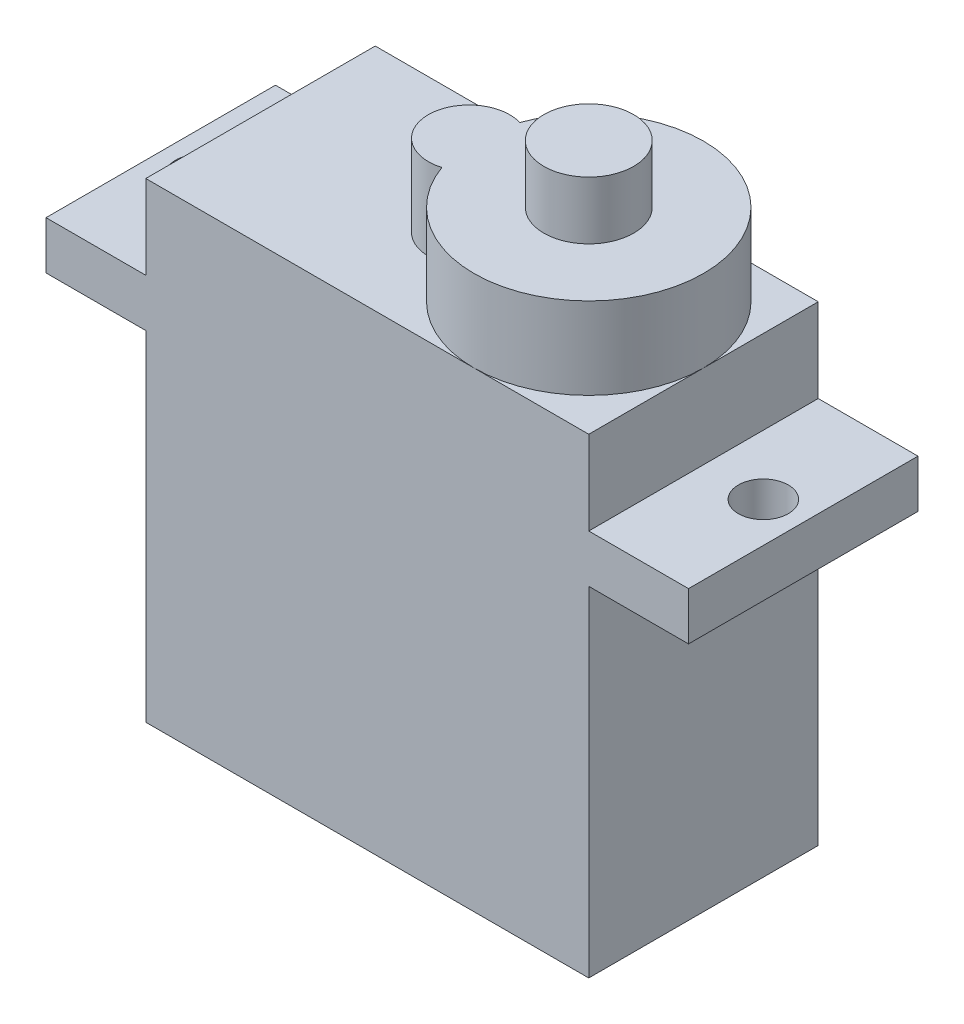
ISO-10303-21;
HEADER;
FILE_DESCRIPTION(('STEP AP214'),'2;1');
FILE_NAME('part.step','',(''),(''),'','','');
FILE_SCHEMA(('AUTOMOTIVE_DESIGN { 1 0 10303 214 1 1 1 1 }'));
ENDSEC;
DATA;
#1=APPLICATION_CONTEXT('core data for automotive mechanical design processes');
#2=APPLICATION_PROTOCOL_DEFINITION('international standard','automotive_design',2000,#1);
#3=PRODUCT_CONTEXT('',#1,'mechanical');
#4=PRODUCT('Part','Part','',(#3));
#5=PRODUCT_RELATED_PRODUCT_CATEGORY('part','',(#4));
#6=PRODUCT_DEFINITION_FORMATION('','',#4);
#7=PRODUCT_DEFINITION_CONTEXT('part definition',#1,'design');
#8=PRODUCT_DEFINITION('design','',#6,#7);
#9=PRODUCT_DEFINITION_SHAPE('','',#8);
#10=(LENGTH_UNIT() NAMED_UNIT(*) SI_UNIT(.MILLI.,.METRE.));
#11=(NAMED_UNIT(*) PLANE_ANGLE_UNIT() SI_UNIT($,.RADIAN.));
#12=(NAMED_UNIT(*) SI_UNIT($,.STERADIAN.) SOLID_ANGLE_UNIT());
#13=UNCERTAINTY_MEASURE_WITH_UNIT(LENGTH_MEASURE(1.E-05),#10,'distance_accuracy_value','');
#14=(GEOMETRIC_REPRESENTATION_CONTEXT(3) GLOBAL_UNCERTAINTY_ASSIGNED_CONTEXT((#13)) GLOBAL_UNIT_ASSIGNED_CONTEXT((#10,
#11,#12)) REPRESENTATION_CONTEXT('',''));
#15=CARTESIAN_POINT('',(0.,0.,0.));
#16=DIRECTION('',(0.,0.,1.));
#17=DIRECTION('',(1.,0.,0.));
#18=AXIS2_PLACEMENT_3D('',#15,#16,#17);
#19=CARTESIAN_POINT('',(5.35,18.8,5.75));
#20=DIRECTION('',(0.,-1.,0.));
#21=DIRECTION('',(0.,0.,-1.));
#22=AXIS2_PLACEMENT_3D('',#19,#20,#21);
#23=CYLINDRICAL_SURFACE('',#22,2.25);
#24=CARTESIAN_POINT('',(5.35,18.8,5.75));
#25=DIRECTION('',(0.,1.,0.));
#26=DIRECTION('',(0.,0.,1.));
#27=AXIS2_PLACEMENT_3D('',#24,#25,#26);
#28=CIRCLE('',#27,2.25);
#29=CARTESIAN_POINT('',(5.35,18.8,8.));
#30=VERTEX_POINT('',#29);
#31=EDGE_CURVE('E11',#30,#30,#28,.T.);
#32=ORIENTED_EDGE('',*,*,#31,.F.);
#33=EDGE_LOOP('',(#32));
#34=FACE_BOUND('',#33,.T.);
#35=CARTESIAN_POINT('',(5.35,11.8,5.75));
#36=DIRECTION('',(0.,1.,0.));
#37=DIRECTION('',(0.,0.,1.));
#38=AXIS2_PLACEMENT_3D('',#35,#36,#37);
#39=CIRCLE('',#38,2.25);
#40=CARTESIAN_POINT('',(5.35,11.8,8.));
#41=VERTEX_POINT('',#40);
#42=EDGE_CURVE('E49',#41,#41,#39,.T.);
#43=ORIENTED_EDGE('',*,*,#42,.T.);
#44=EDGE_LOOP('',(#43));
#45=FACE_BOUND('',#44,.T.);
#46=ADVANCED_FACE('F46',(#34,#45),#23,.T.);
#47=CARTESIAN_POINT('',(0.,18.8,0.));
#48=DIRECTION('',(0.,1.,0.));
#49=DIRECTION('',(0.,0.,1.));
#50=AXIS2_PLACEMENT_3D('',#47,#48,#49);
#51=PLANE('',#50);
#52=ORIENTED_EDGE('',*,*,#31,.T.);
#53=EDGE_LOOP('',(#52));
#54=FACE_BOUND('',#53,.T.);
#55=ADVANCED_FACE('F61',(#54),#51,.T.);
#56=CARTESIAN_POINT('',(0.,11.8,0.));
#57=DIRECTION('',(0.,1.,0.));
#58=DIRECTION('',(0.,0.,1.));
#59=AXIS2_PLACEMENT_3D('',#56,#57,#58);
#60=PLANE('',#59);
#61=ORIENTED_EDGE('',*,*,#42,.F.);
#62=EDGE_LOOP('',(#61));
#63=FACE_BOUND('',#62,.T.);
#64=ADVANCED_FACE('F59',(#63),#60,.F.);
#65=CLOSED_SHELL('',(#46,#55,#64));
#66=MANIFOLD_SOLID_BREP('B2',#65);
#67=CARTESIAN_POINT('',(-11.1,11.8,11.5));
#68=DIRECTION('',(0.,-1.,0.));
#69=DIRECTION('',(0.,0.,-1.));
#70=AXIS2_PLACEMENT_3D('',#67,#68,#69);
#71=PLANE('',#70);
#72=CARTESIAN_POINT('',(5.35,11.8,5.75));
#73=DIRECTION('',(0.,1.,0.));
#74=DIRECTION('',(0.,0.,1.));
#75=AXIS2_PLACEMENT_3D('',#72,#73,#74);
#76=CIRCLE('',#75,5.75);
#77=CARTESIAN_POINT('',(-0.0586735501245782,11.8,7.70160201582772));
#78=VERTEX_POINT('',#77);
#79=CARTESIAN_POINT('',(5.35,11.8,11.5));
#80=VERTEX_POINT('',#79);
#81=EDGE_CURVE('E97',#78,#80,#76,.T.);
#82=ORIENTED_EDGE('',*,*,#81,.F.);
#83=CARTESIAN_POINT('',(-0.650000000000003,11.8,5.75));
#84=DIRECTION('',(0.,1.,0.));
#85=DIRECTION('',(0.,0.,1.));
#86=AXIS2_PLACEMENT_3D('',#83,#84,#85);
#87=CIRCLE('',#86,2.03921980142041);
#88=CARTESIAN_POINT('',(-0.0586735501245765,11.8,3.79839798417227));
#89=VERTEX_POINT('',#88);
#90=EDGE_CURVE('E104',#89,#78,#87,.T.);
#91=ORIENTED_EDGE('',*,*,#90,.F.);
#92=CARTESIAN_POINT('',(5.35,11.8,0.));
#93=VERTEX_POINT('',#92);
#94=EDGE_CURVE('E216',#93,#89,#76,.T.);
#95=ORIENTED_EDGE('',*,*,#94,.F.);
#96=DIRECTION('',(-1.,0.,0.));
#97=VECTOR('',#96,1.);
#98=CARTESIAN_POINT('',(-11.1,11.8,0.));
#99=LINE('',#98,#97);
#100=CARTESIAN_POINT('',(-11.1,11.8,0.));
#101=VERTEX_POINT('',#100);
#102=EDGE_CURVE('E301',#93,#101,#99,.T.);
#103=ORIENTED_EDGE('',*,*,#102,.T.);
#104=DIRECTION('',(0.,0.,-1.));
#105=VECTOR('',#104,1.);
#106=CARTESIAN_POINT('',(-11.1,11.8,11.5));
#107=LINE('',#106,#105);
#108=CARTESIAN_POINT('',(-11.1,11.8,11.5));
#109=VERTEX_POINT('',#108);
#110=EDGE_CURVE('E315',#109,#101,#107,.T.);
#111=ORIENTED_EDGE('',*,*,#110,.F.);
#112=DIRECTION('',(-1.,0.,0.));
#113=VECTOR('',#112,1.);
#114=CARTESIAN_POINT('',(-11.1,11.8,11.5));
#115=LINE('',#114,#113);
#116=EDGE_CURVE('E287',#80,#109,#115,.T.);
#117=ORIENTED_EDGE('',*,*,#116,.F.);
#118=EDGE_LOOP('',(#82,#91,#95,#103,#111,#117));
#119=FACE_BOUND('',#118,.T.);
#120=ADVANCED_FACE('F86',(#119),#71,.F.);
#121=CARTESIAN_POINT('',(11.1,11.8,5.75));
#122=VERTEX_POINT('',#121);
#123=EDGE_CURVE('E44',#80,#122,#76,.T.);
#124=ORIENTED_EDGE('',*,*,#123,.F.);
#125=CARTESIAN_POINT('',(11.1,11.8,11.5));
#126=VERTEX_POINT('',#125);
#127=EDGE_CURVE('E289',#126,#80,#115,.T.);
#128=ORIENTED_EDGE('',*,*,#127,.F.);
#129=DIRECTION('',(0.,0.,-1.));
#130=VECTOR('',#129,1.);
#131=CARTESIAN_POINT('',(11.1,11.8,11.5));
#132=LINE('',#131,#130);
#133=EDGE_CURVE('E318',#126,#122,#132,.T.);
#134=ORIENTED_EDGE('',*,*,#133,.T.);
#135=EDGE_LOOP('',(#124,#128,#134));
#136=FACE_BOUND('',#135,.T.);
#137=ADVANCED_FACE('F365',(#136),#71,.F.);
#138=CARTESIAN_POINT('',(-11.1,11.8,11.5));
#139=DIRECTION('',(1.,0.,0.));
#140=DIRECTION('',(0.,1.,0.));
#141=AXIS2_PLACEMENT_3D('',#138,#139,#140);
#142=PLANE('',#141);
#143=DIRECTION('',(0.,-1.,0.));
#144=VECTOR('',#143,1.);
#145=CARTESIAN_POINT('',(-11.1,11.8,11.5));
#146=LINE('',#145,#144);
#147=CARTESIAN_POINT('',(-11.1,5.2,11.5));
#148=VERTEX_POINT('',#147);
#149=CARTESIAN_POINT('',(-11.1,-11.8,11.5));
#150=VERTEX_POINT('',#149);
#151=EDGE_CURVE('E292',#148,#150,#146,.T.);
#152=ORIENTED_EDGE('',*,*,#151,.F.);
#153=DIRECTION('',(0.,0.,-1.));
#154=VECTOR('',#153,1.);
#155=CARTESIAN_POINT('',(-11.1,5.2,11.5));
#156=LINE('',#155,#154);
#157=CARTESIAN_POINT('',(-11.1,5.2,0.));
#158=VERTEX_POINT('',#157);
#159=EDGE_CURVE('E235',#148,#158,#156,.T.);
#160=ORIENTED_EDGE('',*,*,#159,.T.);
#161=DIRECTION('',(0.,-1.,0.));
#162=VECTOR('',#161,1.);
#163=CARTESIAN_POINT('',(-11.1,11.8,0.));
#164=LINE('',#163,#162);
#165=CARTESIAN_POINT('',(-11.1,-11.8,0.));
#166=VERTEX_POINT('',#165);
#167=EDGE_CURVE('E304',#158,#166,#164,.T.);
#168=ORIENTED_EDGE('',*,*,#167,.T.);
#169=DIRECTION('',(0.,0.,-1.));
#170=VECTOR('',#169,1.);
#171=CARTESIAN_POINT('',(-11.1,-11.8,11.5));
#172=LINE('',#171,#170);
#173=EDGE_CURVE('E312',#150,#166,#172,.T.);
#174=ORIENTED_EDGE('',*,*,#173,.F.);
#175=EDGE_LOOP('',(#152,#160,#168,#174));
#176=FACE_BOUND('',#175,.T.);
#177=ADVANCED_FACE('F369',(#176),#142,.F.);
#178=CARTESIAN_POINT('',(11.1,11.8,11.5));
#179=DIRECTION('',(-1.,0.,0.));
#180=DIRECTION('',(0.,-1.,0.));
#181=AXIS2_PLACEMENT_3D('',#178,#179,#180);
#182=PLANE('',#181);
#183=DIRECTION('',(0.,0.,1.));
#184=VECTOR('',#183,1.);
#185=CARTESIAN_POINT('',(11.1,7.6,11.5));
#186=LINE('',#185,#184);
#187=CARTESIAN_POINT('',(11.1,7.6,0.));
#188=VERTEX_POINT('',#187);
#189=CARTESIAN_POINT('',(11.1,7.6,11.5));
#190=VERTEX_POINT('',#189);
#191=EDGE_CURVE('E261',#188,#190,#186,.T.);
#192=ORIENTED_EDGE('',*,*,#191,.F.);
#193=DIRECTION('',(0.,1.,0.));
#194=VECTOR('',#193,1.);
#195=CARTESIAN_POINT('',(11.1,11.8,0.));
#196=LINE('',#195,#194);
#197=CARTESIAN_POINT('',(11.1,11.8,0.));
#198=VERTEX_POINT('',#197);
#199=EDGE_CURVE('E283',#188,#198,#196,.T.);
#200=ORIENTED_EDGE('',*,*,#199,.T.);
#201=EDGE_CURVE('E317',#122,#198,#132,.T.);
#202=ORIENTED_EDGE('',*,*,#201,.F.);
#203=ORIENTED_EDGE('',*,*,#133,.F.);
#204=DIRECTION('',(0.,1.,0.));
#205=VECTOR('',#204,1.);
#206=CARTESIAN_POINT('',(11.1,11.8,11.5));
#207=LINE('',#206,#205);
#208=EDGE_CURVE('E288',#190,#126,#207,.T.);
#209=ORIENTED_EDGE('',*,*,#208,.F.);
#210=EDGE_LOOP('',(#192,#200,#202,#203,#209));
#211=FACE_BOUND('',#210,.T.);
#212=ADVANCED_FACE('F88',(#211),#182,.F.);
#213=DIRECTION('',(0.,0.,-1.));
#214=VECTOR('',#213,1.);
#215=CARTESIAN_POINT('',(11.1,5.2,11.5));
#216=LINE('',#215,#214);
#217=CARTESIAN_POINT('',(11.1,5.2,11.5));
#218=VERTEX_POINT('',#217);
#219=CARTESIAN_POINT('',(11.1,5.2,0.));
#220=VERTEX_POINT('',#219);
#221=EDGE_CURVE('E256',#218,#220,#216,.T.);
#222=ORIENTED_EDGE('',*,*,#221,.F.);
#223=CARTESIAN_POINT('',(11.1,-11.8,11.5));
#224=VERTEX_POINT('',#223);
#225=EDGE_CURVE('E284',#224,#218,#207,.T.);
#226=ORIENTED_EDGE('',*,*,#225,.F.);
#227=DIRECTION('',(0.,0.,-1.));
#228=VECTOR('',#227,1.);
#229=CARTESIAN_POINT('',(11.1,-11.8,11.5));
#230=LINE('',#229,#228);
#231=CARTESIAN_POINT('',(11.1,-11.8,0.));
#232=VERTEX_POINT('',#231);
#233=EDGE_CURVE('E298',#224,#232,#230,.T.);
#234=ORIENTED_EDGE('',*,*,#233,.T.);
#235=EDGE_CURVE('E299',#232,#220,#196,.T.);
#236=ORIENTED_EDGE('',*,*,#235,.T.);
#237=EDGE_LOOP('',(#222,#226,#234,#236));
#238=FACE_BOUND('',#237,.T.);
#239=ADVANCED_FACE('F378',(#238),#182,.F.);
#240=EDGE_CURVE('E95',#122,#93,#76,.T.);
#241=ORIENTED_EDGE('',*,*,#240,.F.);
#242=ORIENTED_EDGE('',*,*,#201,.T.);
#243=EDGE_CURVE('E302',#198,#93,#99,.T.);
#244=ORIENTED_EDGE('',*,*,#243,.T.);
#245=EDGE_LOOP('',(#241,#242,#244));
#246=FACE_BOUND('',#245,.T.);
#247=ADVANCED_FACE('F324',(#246),#71,.F.);
#248=CARTESIAN_POINT('',(-11.1,7.6,0.));
#249=VERTEX_POINT('',#248);
#250=EDGE_CURVE('E305',#101,#249,#164,.T.);
#251=ORIENTED_EDGE('',*,*,#250,.T.);
#252=DIRECTION('',(0.,0.,1.));
#253=VECTOR('',#252,1.);
#254=CARTESIAN_POINT('',(-11.1,7.6,11.5));
#255=LINE('',#254,#253);
#256=CARTESIAN_POINT('',(-11.1,7.6,11.5));
#257=VERTEX_POINT('',#256);
#258=EDGE_CURVE('E230',#249,#257,#255,.T.);
#259=ORIENTED_EDGE('',*,*,#258,.T.);
#260=EDGE_CURVE('E293',#109,#257,#146,.T.);
#261=ORIENTED_EDGE('',*,*,#260,.F.);
#262=ORIENTED_EDGE('',*,*,#110,.T.);
#263=EDGE_LOOP('',(#251,#259,#261,#262));
#264=FACE_BOUND('',#263,.T.);
#265=ADVANCED_FACE('F338',(#264),#142,.F.);
#266=CARTESIAN_POINT('',(-11.1,-11.8,11.5));
#267=DIRECTION('',(0.,1.,0.));
#268=DIRECTION('',(0.,0.,1.));
#269=AXIS2_PLACEMENT_3D('',#266,#267,#268);
#270=PLANE('',#269);
#271=DIRECTION('',(1.,0.,0.));
#272=VECTOR('',#271,1.);
#273=CARTESIAN_POINT('',(-11.1,-11.8,0.));
#274=LINE('',#273,#272);
#275=EDGE_CURVE('E308',#166,#232,#274,.T.);
#276=ORIENTED_EDGE('',*,*,#275,.T.);
#277=ORIENTED_EDGE('',*,*,#233,.F.);
#278=DIRECTION('',(1.,0.,0.));
#279=VECTOR('',#278,1.);
#280=CARTESIAN_POINT('',(-11.1,-11.8,11.5));
#281=LINE('',#280,#279);
#282=EDGE_CURVE('E296',#150,#224,#281,.T.);
#283=ORIENTED_EDGE('',*,*,#282,.F.);
#284=ORIENTED_EDGE('',*,*,#173,.T.);
#285=EDGE_LOOP('',(#276,#277,#283,#284));
#286=FACE_BOUND('',#285,.T.);
#287=ADVANCED_FACE('F383',(#286),#270,.F.);
#288=CARTESIAN_POINT('',(0.,0.,11.5));
#289=DIRECTION('',(0.,0.,1.));
#290=DIRECTION('',(1.,0.,0.));
#291=AXIS2_PLACEMENT_3D('',#288,#289,#290);
#292=PLANE('',#291);
#293=ORIENTED_EDGE('',*,*,#225,.T.);
#294=DIRECTION('',(-1.,0.,0.));
#295=VECTOR('',#294,1.);
#296=CARTESIAN_POINT('',(16.1,5.2,11.5));
#297=LINE('',#296,#295);
#298=CARTESIAN_POINT('',(16.1,5.2,11.5));
#299=VERTEX_POINT('',#298);
#300=EDGE_CURVE('E280',#299,#218,#297,.T.);
#301=ORIENTED_EDGE('',*,*,#300,.F.);
#302=DIRECTION('',(0.,-1.,0.));
#303=VECTOR('',#302,1.);
#304=CARTESIAN_POINT('',(16.1,7.6,11.5));
#305=LINE('',#304,#303);
#306=CARTESIAN_POINT('',(16.1,7.6,11.5));
#307=VERTEX_POINT('',#306);
#308=EDGE_CURVE('E257',#307,#299,#305,.T.);
#309=ORIENTED_EDGE('',*,*,#308,.F.);
#310=DIRECTION('',(-1.,0.,0.));
#311=VECTOR('',#310,1.);
#312=CARTESIAN_POINT('',(16.1,7.6,11.5));
#313=LINE('',#312,#311);
#314=EDGE_CURVE('E267',#307,#190,#313,.T.);
#315=ORIENTED_EDGE('',*,*,#314,.T.);
#316=ORIENTED_EDGE('',*,*,#208,.T.);
#317=ORIENTED_EDGE('',*,*,#127,.T.);
#318=ORIENTED_EDGE('',*,*,#116,.T.);
#319=ORIENTED_EDGE('',*,*,#260,.T.);
#320=DIRECTION('',(1.,0.,0.));
#321=VECTOR('',#320,1.);
#322=CARTESIAN_POINT('',(-16.1,7.6,11.5));
#323=LINE('',#322,#321);
#324=CARTESIAN_POINT('',(-16.1,7.6,11.5));
#325=VERTEX_POINT('',#324);
#326=EDGE_CURVE('E254',#325,#257,#323,.T.);
#327=ORIENTED_EDGE('',*,*,#326,.F.);
#328=DIRECTION('',(0.,-1.,0.));
#329=VECTOR('',#328,1.);
#330=CARTESIAN_POINT('',(-16.1,7.6,11.5));
#331=LINE('',#330,#329);
#332=CARTESIAN_POINT('',(-16.1,5.2,11.5));
#333=VERTEX_POINT('',#332);
#334=EDGE_CURVE('E231',#325,#333,#331,.T.);
#335=ORIENTED_EDGE('',*,*,#334,.T.);
#336=DIRECTION('',(1.,0.,0.));
#337=VECTOR('',#336,1.);
#338=CARTESIAN_POINT('',(-16.1,5.2,11.5));
#339=LINE('',#338,#337);
#340=EDGE_CURVE('E244',#333,#148,#339,.T.);
#341=ORIENTED_EDGE('',*,*,#340,.T.);
#342=ORIENTED_EDGE('',*,*,#151,.T.);
#343=ORIENTED_EDGE('',*,*,#282,.T.);
#344=EDGE_LOOP('',(#293,#301,#309,#315,#316,#317,#318,#319,#327,#335,#341,#342,#343));
#345=FACE_BOUND('',#344,.T.);
#346=ADVANCED_FACE('F341',(#345),#292,.T.);
#347=CARTESIAN_POINT('',(0.,0.,0.));
#348=DIRECTION('',(0.,0.,1.));
#349=DIRECTION('',(1.,0.,0.));
#350=AXIS2_PLACEMENT_3D('',#347,#348,#349);
#351=PLANE('',#350);
#352=ORIENTED_EDGE('',*,*,#235,.F.);
#353=ORIENTED_EDGE('',*,*,#275,.F.);
#354=ORIENTED_EDGE('',*,*,#167,.F.);
#355=DIRECTION('',(1.,0.,0.));
#356=VECTOR('',#355,1.);
#357=CARTESIAN_POINT('',(-16.1,5.2,0.));
#358=LINE('',#357,#356);
#359=CARTESIAN_POINT('',(-16.1,5.2,0.));
#360=VERTEX_POINT('',#359);
#361=EDGE_CURVE('E250',#360,#158,#358,.T.);
#362=ORIENTED_EDGE('',*,*,#361,.F.);
#363=DIRECTION('',(0.,1.,0.));
#364=VECTOR('',#363,1.);
#365=CARTESIAN_POINT('',(-16.1,7.6,0.));
#366=LINE('',#365,#364);
#367=CARTESIAN_POINT('',(-16.1,7.6,0.));
#368=VERTEX_POINT('',#367);
#369=EDGE_CURVE('E238',#360,#368,#366,.T.);
#370=ORIENTED_EDGE('',*,*,#369,.T.);
#371=DIRECTION('',(1.,0.,0.));
#372=VECTOR('',#371,1.);
#373=CARTESIAN_POINT('',(-16.1,7.6,0.));
#374=LINE('',#373,#372);
#375=EDGE_CURVE('E252',#368,#249,#374,.T.);
#376=ORIENTED_EDGE('',*,*,#375,.T.);
#377=ORIENTED_EDGE('',*,*,#250,.F.);
#378=ORIENTED_EDGE('',*,*,#102,.F.);
#379=ORIENTED_EDGE('',*,*,#243,.F.);
#380=ORIENTED_EDGE('',*,*,#199,.F.);
#381=DIRECTION('',(-1.,0.,0.));
#382=VECTOR('',#381,1.);
#383=CARTESIAN_POINT('',(16.1,7.6,0.));
#384=LINE('',#383,#382);
#385=CARTESIAN_POINT('',(16.1,7.6,0.));
#386=VERTEX_POINT('',#385);
#387=EDGE_CURVE('E274',#386,#188,#384,.T.);
#388=ORIENTED_EDGE('',*,*,#387,.F.);
#389=DIRECTION('',(0.,1.,0.));
#390=VECTOR('',#389,1.);
#391=CARTESIAN_POINT('',(16.1,7.6,0.));
#392=LINE('',#391,#390);
#393=CARTESIAN_POINT('',(16.1,5.2,0.));
#394=VERTEX_POINT('',#393);
#395=EDGE_CURVE('E263',#394,#386,#392,.T.);
#396=ORIENTED_EDGE('',*,*,#395,.F.);
#397=DIRECTION('',(-1.,0.,0.));
#398=VECTOR('',#397,1.);
#399=CARTESIAN_POINT('',(16.1,5.2,0.));
#400=LINE('',#399,#398);
#401=EDGE_CURVE('E277',#394,#220,#400,.T.);
#402=ORIENTED_EDGE('',*,*,#401,.T.);
#403=EDGE_LOOP('',(#352,#353,#354,#362,#370,#376,#377,#378,#379,#380,#388,#396,#402));
#404=FACE_BOUND('',#403,.T.);
#405=ADVANCED_FACE('F332',(#404),#351,.F.);
#406=CARTESIAN_POINT('',(16.1,5.2,11.5));
#407=DIRECTION('',(0.,1.,0.));
#408=DIRECTION('',(-1.,0.,0.));
#409=AXIS2_PLACEMENT_3D('',#406,#407,#408);
#410=PLANE('',#409);
#411=CARTESIAN_POINT('',(14.1,5.2,5.75));
#412=DIRECTION('',(0.,1.,0.));
#413=DIRECTION('',(-1.,0.,0.));
#414=AXIS2_PLACEMENT_3D('',#411,#412,#413);
#415=CIRCLE('',#414,1.25);
#416=CARTESIAN_POINT('',(12.85,5.2,5.75));
#417=VERTEX_POINT('',#416);
#418=EDGE_CURVE('E227',#417,#417,#415,.T.);
#419=ORIENTED_EDGE('',*,*,#418,.T.);
#420=EDGE_LOOP('',(#419));
#421=FACE_BOUND('',#420,.T.);
#422=ORIENTED_EDGE('',*,*,#221,.T.);
#423=ORIENTED_EDGE('',*,*,#401,.F.);
#424=DIRECTION('',(0.,0.,-1.));
#425=VECTOR('',#424,1.);
#426=CARTESIAN_POINT('',(16.1,5.2,11.5));
#427=LINE('',#426,#425);
#428=EDGE_CURVE('E260',#299,#394,#427,.T.);
#429=ORIENTED_EDGE('',*,*,#428,.F.);
#430=ORIENTED_EDGE('',*,*,#300,.T.);
#431=EDGE_LOOP('',(#422,#423,#429,#430));
#432=FACE_BOUND('',#431,.T.);
#433=ADVANCED_FACE('F395',(#421,#432),#410,.F.);
#434=CARTESIAN_POINT('',(16.1,7.6,11.5));
#435=DIRECTION('',(0.,-1.,0.));
#436=DIRECTION('',(1.,0.,0.));
#437=AXIS2_PLACEMENT_3D('',#434,#435,#436);
#438=PLANE('',#437);
#439=CARTESIAN_POINT('',(14.1,7.6,5.75));
#440=DIRECTION('',(0.,1.,0.));
#441=DIRECTION('',(-1.,0.,0.));
#442=AXIS2_PLACEMENT_3D('',#439,#440,#441);
#443=CIRCLE('',#442,1.25);
#444=CARTESIAN_POINT('',(12.85,7.6,5.75));
#445=VERTEX_POINT('',#444);
#446=EDGE_CURVE('E220',#445,#445,#443,.T.);
#447=ORIENTED_EDGE('',*,*,#446,.F.);
#448=EDGE_LOOP('',(#447));
#449=FACE_BOUND('',#448,.T.);
#450=ORIENTED_EDGE('',*,*,#191,.T.);
#451=ORIENTED_EDGE('',*,*,#314,.F.);
#452=DIRECTION('',(0.,0.,1.));
#453=VECTOR('',#452,1.);
#454=CARTESIAN_POINT('',(16.1,7.6,11.5));
#455=LINE('',#454,#453);
#456=EDGE_CURVE('E265',#386,#307,#455,.T.);
#457=ORIENTED_EDGE('',*,*,#456,.F.);
#458=ORIENTED_EDGE('',*,*,#387,.T.);
#459=EDGE_LOOP('',(#450,#451,#457,#458));
#460=FACE_BOUND('',#459,.T.);
#461=ADVANCED_FACE('F402',(#449,#460),#438,.F.);
#462=CARTESIAN_POINT('',(16.1,0.,0.));
#463=DIRECTION('',(1.,0.,0.));
#464=DIRECTION('',(0.,0.,-1.));
#465=AXIS2_PLACEMENT_3D('',#462,#463,#464);
#466=PLANE('',#465);
#467=ORIENTED_EDGE('',*,*,#308,.T.);
#468=ORIENTED_EDGE('',*,*,#428,.T.);
#469=ORIENTED_EDGE('',*,*,#395,.T.);
#470=ORIENTED_EDGE('',*,*,#456,.T.);
#471=EDGE_LOOP('',(#467,#468,#469,#470));
#472=FACE_BOUND('',#471,.T.);
#473=ADVANCED_FACE('F398',(#472),#466,.T.);
#474=CARTESIAN_POINT('',(-16.1,7.6,11.5));
#475=DIRECTION('',(0.,1.,0.));
#476=DIRECTION('',(-1.,0.,0.));
#477=AXIS2_PLACEMENT_3D('',#474,#475,#476);
#478=PLANE('',#477);
#479=CARTESIAN_POINT('',(-14.1,7.6,5.75));
#480=DIRECTION('',(0.,1.,0.));
#481=DIRECTION('',(1.,0.,0.));
#482=AXIS2_PLACEMENT_3D('',#479,#480,#481);
#483=CIRCLE('',#482,1.25);
#484=CARTESIAN_POINT('',(-12.85,7.6,5.75));
#485=VERTEX_POINT('',#484);
#486=EDGE_CURVE('E217',#485,#485,#483,.T.);
#487=ORIENTED_EDGE('',*,*,#486,.F.);
#488=EDGE_LOOP('',(#487));
#489=FACE_BOUND('',#488,.T.);
#490=ORIENTED_EDGE('',*,*,#258,.F.);
#491=ORIENTED_EDGE('',*,*,#375,.F.);
#492=DIRECTION('',(0.,0.,1.));
#493=VECTOR('',#492,1.);
#494=CARTESIAN_POINT('',(-16.1,7.6,11.5));
#495=LINE('',#494,#493);
#496=EDGE_CURVE('E234',#368,#325,#495,.T.);
#497=ORIENTED_EDGE('',*,*,#496,.T.);
#498=ORIENTED_EDGE('',*,*,#326,.T.);
#499=EDGE_LOOP('',(#490,#491,#497,#498));
#500=FACE_BOUND('',#499,.T.);
#501=ADVANCED_FACE('F418',(#489,#500),#478,.T.);
#502=CARTESIAN_POINT('',(-16.1,5.2,11.5));
#503=DIRECTION('',(0.,-1.,0.));
#504=DIRECTION('',(1.,0.,0.));
#505=AXIS2_PLACEMENT_3D('',#502,#503,#504);
#506=PLANE('',#505);
#507=CARTESIAN_POINT('',(-14.1,5.2,5.75));
#508=DIRECTION('',(0.,-1.,0.));
#509=DIRECTION('',(1.,0.,0.));
#510=AXIS2_PLACEMENT_3D('',#507,#508,#509);
#511=CIRCLE('',#510,1.25);
#512=CARTESIAN_POINT('',(-12.85,5.2,5.75));
#513=VERTEX_POINT('',#512);
#514=EDGE_CURVE('E90',#513,#513,#511,.T.);
#515=ORIENTED_EDGE('',*,*,#514,.F.);
#516=EDGE_LOOP('',(#515));
#517=FACE_BOUND('',#516,.T.);
#518=ORIENTED_EDGE('',*,*,#159,.F.);
#519=ORIENTED_EDGE('',*,*,#340,.F.);
#520=DIRECTION('',(0.,0.,-1.));
#521=VECTOR('',#520,1.);
#522=CARTESIAN_POINT('',(-16.1,5.2,11.5));
#523=LINE('',#522,#521);
#524=EDGE_CURVE('E241',#333,#360,#523,.T.);
#525=ORIENTED_EDGE('',*,*,#524,.T.);
#526=ORIENTED_EDGE('',*,*,#361,.T.);
#527=EDGE_LOOP('',(#518,#519,#525,#526));
#528=FACE_BOUND('',#527,.T.);
#529=ADVANCED_FACE('F411',(#517,#528),#506,.T.);
#530=CARTESIAN_POINT('',(-16.1,0.,0.));
#531=DIRECTION('',(-1.,0.,0.));
#532=DIRECTION('',(0.,0.,-1.));
#533=AXIS2_PLACEMENT_3D('',#530,#531,#532);
#534=PLANE('',#533);
#535=ORIENTED_EDGE('',*,*,#334,.F.);
#536=ORIENTED_EDGE('',*,*,#496,.F.);
#537=ORIENTED_EDGE('',*,*,#369,.F.);
#538=ORIENTED_EDGE('',*,*,#524,.F.);
#539=EDGE_LOOP('',(#535,#536,#537,#538));
#540=FACE_BOUND('',#539,.T.);
#541=ADVANCED_FACE('F416',(#540),#534,.T.);
#542=CARTESIAN_POINT('',(-14.1,2.6,5.75));
#543=DIRECTION('',(0.,1.,0.));
#544=DIRECTION('',(-1.,0.,0.));
#545=AXIS2_PLACEMENT_3D('',#542,#543,#544);
#546=CYLINDRICAL_SURFACE('',#545,1.25);
#547=ORIENTED_EDGE('',*,*,#514,.T.);
#548=EDGE_LOOP('',(#547));
#549=FACE_BOUND('',#548,.T.);
#550=ORIENTED_EDGE('',*,*,#486,.T.);
#551=EDGE_LOOP('',(#550));
#552=FACE_BOUND('',#551,.T.);
#553=ADVANCED_FACE('F490',(#549,#552),#546,.F.);
#554=CARTESIAN_POINT('',(14.1,2.6,5.75));
#555=DIRECTION('',(0.,1.,0.));
#556=DIRECTION('',(-1.,0.,0.));
#557=AXIS2_PLACEMENT_3D('',#554,#555,#556);
#558=CYLINDRICAL_SURFACE('',#557,1.25);
#559=ORIENTED_EDGE('',*,*,#446,.T.);
#560=EDGE_LOOP('',(#559));
#561=FACE_BOUND('',#560,.T.);
#562=ORIENTED_EDGE('',*,*,#418,.F.);
#563=EDGE_LOOP('',(#562));
#564=FACE_BOUND('',#563,.T.);
#565=ADVANCED_FACE('F361',(#561,#564),#558,.F.);
#566=CARTESIAN_POINT('',(5.35,15.9,5.75));
#567=DIRECTION('',(0.,-1.,0.));
#568=DIRECTION('',(0.,0.,-1.));
#569=AXIS2_PLACEMENT_3D('',#566,#567,#568);
#570=CYLINDRICAL_SURFACE('',#569,5.75);
#571=ORIENTED_EDGE('',*,*,#81,.T.);
#572=ORIENTED_EDGE('',*,*,#123,.T.);
#573=ORIENTED_EDGE('',*,*,#240,.T.);
#574=ORIENTED_EDGE('',*,*,#94,.T.);
#575=DIRECTION('',(0.,-1.,0.));
#576=VECTOR('',#575,1.);
#577=CARTESIAN_POINT('',(-0.0586735501245765,15.9,3.79839798417227));
#578=LINE('',#577,#576);
#579=CARTESIAN_POINT('',(-0.0586735501245765,15.9,3.79839798417227));
#580=VERTEX_POINT('',#579);
#581=EDGE_CURVE('E203',#580,#89,#578,.T.);
#582=ORIENTED_EDGE('',*,*,#581,.F.);
#583=CARTESIAN_POINT('',(5.35,15.9,5.75));
#584=DIRECTION('',(0.,1.,0.));
#585=DIRECTION('',(0.,0.,1.));
#586=AXIS2_PLACEMENT_3D('',#583,#584,#585);
#587=CIRCLE('',#586,5.75);
#588=CARTESIAN_POINT('',(-0.0586735501245782,15.9,7.70160201582772));
#589=VERTEX_POINT('',#588);
#590=EDGE_CURVE('E208',#589,#580,#587,.T.);
#591=ORIENTED_EDGE('',*,*,#590,.F.);
#592=DIRECTION('',(0.,-1.,0.));
#593=VECTOR('',#592,1.);
#594=CARTESIAN_POINT('',(-0.0586735501245782,15.9,7.70160201582772));
#595=LINE('',#594,#593);
#596=EDGE_CURVE('E205',#589,#78,#595,.T.);
#597=ORIENTED_EDGE('',*,*,#596,.T.);
#598=EDGE_LOOP('',(#571,#572,#573,#574,#582,#591,#597));
#599=FACE_BOUND('',#598,.T.);
#600=ADVANCED_FACE('F215',(#599),#570,.T.);
#601=CARTESIAN_POINT('',(5.35,15.9,5.75));
#602=DIRECTION('',(0.,-1.,0.));
#603=DIRECTION('',(0.,0.,-1.));
#604=AXIS2_PLACEMENT_3D('',#601,#602,#603);
#605=CYLINDRICAL_SURFACE('',#604,2.25);
#606=CARTESIAN_POINT('',(5.35,15.9,5.75));
#607=DIRECTION('',(0.,1.,0.));
#608=DIRECTION('',(0.,0.,1.));
#609=AXIS2_PLACEMENT_3D('',#606,#607,#608);
#610=CIRCLE('',#609,2.25);
#611=CARTESIAN_POINT('',(5.35,15.9,8.));
#612=VERTEX_POINT('',#611);
#613=EDGE_CURVE('E212',#612,#612,#610,.T.);
#614=ORIENTED_EDGE('',*,*,#613,.T.);
#615=EDGE_LOOP('',(#614));
#616=FACE_BOUND('',#615,.T.);
#617=CARTESIAN_POINT('',(5.35,11.8,5.75));
#618=DIRECTION('',(0.,1.,0.));
#619=DIRECTION('',(0.,0.,1.));
#620=AXIS2_PLACEMENT_3D('',#617,#618,#619);
#621=CIRCLE('',#620,2.25);
#622=CARTESIAN_POINT('',(5.35,11.8,8.));
#623=VERTEX_POINT('',#622);
#624=EDGE_CURVE('E343',#623,#623,#621,.T.);
#625=ORIENTED_EDGE('',*,*,#624,.F.);
#626=EDGE_LOOP('',(#625));
#627=FACE_BOUND('',#626,.T.);
#628=ADVANCED_FACE('F352',(#616,#627),#605,.F.);
#629=CARTESIAN_POINT('',(-0.650000000000003,15.9,5.75));
#630=DIRECTION('',(0.,-1.,0.));
#631=DIRECTION('',(0.,0.,-1.));
#632=AXIS2_PLACEMENT_3D('',#629,#630,#631);
#633=CYLINDRICAL_SURFACE('',#632,2.03921980142041);
#634=ORIENTED_EDGE('',*,*,#90,.T.);
#635=ORIENTED_EDGE('',*,*,#596,.F.);
#636=CARTESIAN_POINT('',(-0.650000000000003,15.9,5.75));
#637=DIRECTION('',(0.,1.,0.));
#638=DIRECTION('',(0.,0.,1.));
#639=AXIS2_PLACEMENT_3D('',#636,#637,#638);
#640=CIRCLE('',#639,2.03921980142041);
#641=EDGE_CURVE('E199',#580,#589,#640,.T.);
#642=ORIENTED_EDGE('',*,*,#641,.F.);
#643=ORIENTED_EDGE('',*,*,#581,.T.);
#644=EDGE_LOOP('',(#634,#635,#642,#643));
#645=FACE_BOUND('',#644,.T.);
#646=ADVANCED_FACE('F201',(#645),#633,.T.);
#647=CARTESIAN_POINT('',(0.,15.9,0.));
#648=DIRECTION('',(0.,1.,0.));
#649=DIRECTION('',(0.,0.,1.));
#650=AXIS2_PLACEMENT_3D('',#647,#648,#649);
#651=PLANE('',#650);
#652=ORIENTED_EDGE('',*,*,#613,.F.);
#653=EDGE_LOOP('',(#652));
#654=FACE_BOUND('',#653,.T.);
#655=ORIENTED_EDGE('',*,*,#590,.T.);
#656=ORIENTED_EDGE('',*,*,#641,.T.);
#657=EDGE_LOOP('',(#655,#656));
#658=FACE_BOUND('',#657,.T.);
#659=ADVANCED_FACE('F210',(#654,#658),#651,.T.);
#660=ORIENTED_EDGE('',*,*,#624,.T.);
#661=EDGE_LOOP('',(#660));
#662=FACE_BOUND('',#661,.T.);
#663=ADVANCED_FACE('F350',(#662),#71,.F.);
#664=CLOSED_SHELL('',(#120,#137,#177,#212,#239,#247,#265,#287,#346,#405,#433,#461,#473,#501,
#529,#541,#553,#565,#600,#628,#646,#659,#663));
#665=MANIFOLD_SOLID_BREP('B6',#664);
#666=ADVANCED_BREP_SHAPE_REPRESENTATION('',(#18,#66,#665),#14);
#667=SHAPE_DEFINITION_REPRESENTATION(#9,#666);
ENDSEC;
END-ISO-10303-21;
